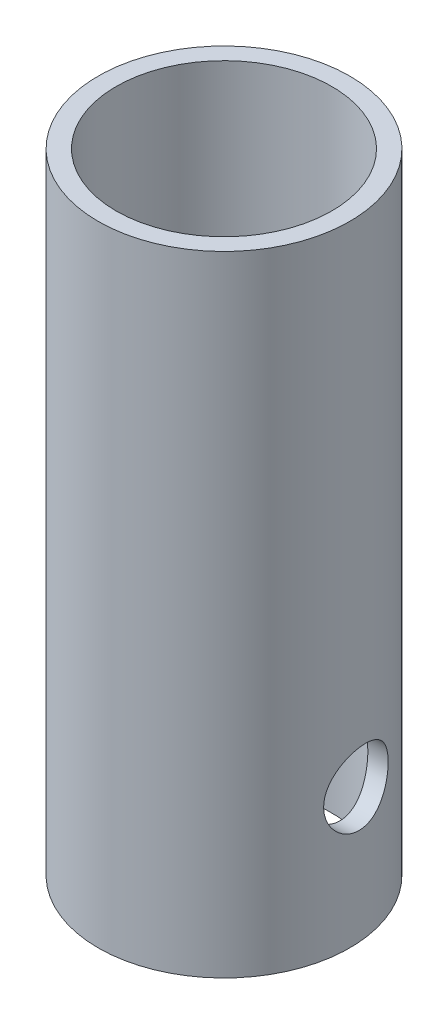
ISO-10303-21;
HEADER;
FILE_DESCRIPTION(('STEP AP214'),'2;1');
FILE_NAME('part.step','',(''),(''),'','','');
FILE_SCHEMA(('AUTOMOTIVE_DESIGN { 1 0 10303 214 1 1 1 1 }'));
ENDSEC;
DATA;
#1=APPLICATION_CONTEXT('core data for automotive mechanical design processes');
#2=APPLICATION_PROTOCOL_DEFINITION('international standard','automotive_design',2000,#1);
#3=PRODUCT_CONTEXT('',#1,'mechanical');
#4=PRODUCT('Part','Part','',(#3));
#5=PRODUCT_RELATED_PRODUCT_CATEGORY('part','',(#4));
#6=PRODUCT_DEFINITION_FORMATION('','',#4);
#7=PRODUCT_DEFINITION_CONTEXT('part definition',#1,'design');
#8=PRODUCT_DEFINITION('design','',#6,#7);
#9=PRODUCT_DEFINITION_SHAPE('','',#8);
#10=(LENGTH_UNIT() NAMED_UNIT(*) SI_UNIT(.MILLI.,.METRE.));
#11=(NAMED_UNIT(*) PLANE_ANGLE_UNIT() SI_UNIT($,.RADIAN.));
#12=(NAMED_UNIT(*) SI_UNIT($,.STERADIAN.) SOLID_ANGLE_UNIT());
#13=UNCERTAINTY_MEASURE_WITH_UNIT(LENGTH_MEASURE(1.E-05),#10,'distance_accuracy_value','');
#14=(GEOMETRIC_REPRESENTATION_CONTEXT(3) GLOBAL_UNCERTAINTY_ASSIGNED_CONTEXT((#13)) GLOBAL_UNIT_ASSIGNED_CONTEXT((#10,
#11,#12)) REPRESENTATION_CONTEXT('',''));
#15=CARTESIAN_POINT('',(0.,0.,0.));
#16=DIRECTION('',(0.,0.,1.));
#17=DIRECTION('',(1.,0.,0.));
#18=AXIS2_PLACEMENT_3D('',#15,#16,#17);
#19=CARTESIAN_POINT('',(0.,70.,0.));
#20=DIRECTION('',(0.,1.,0.));
#21=DIRECTION('',(0.,0.,1.));
#22=AXIS2_PLACEMENT_3D('',#19,#20,#21);
#23=PLANE('',#22);
#24=CARTESIAN_POINT('',(0.,70.,0.));
#25=DIRECTION('',(0.,1.,0.));
#26=DIRECTION('',(0.,0.,1.));
#27=AXIS2_PLACEMENT_3D('',#24,#25,#26);
#28=CIRCLE('',#27,14.);
#29=CARTESIAN_POINT('',(0.,70.,14.));
#30=VERTEX_POINT('',#29);
#31=EDGE_CURVE('E10',#30,#30,#28,.T.);
#32=ORIENTED_EDGE('',*,*,#31,.T.);
#33=EDGE_LOOP('',(#32));
#34=FACE_BOUND('',#33,.T.);
#35=CARTESIAN_POINT('',(0.,70.,0.));
#36=DIRECTION('',(0.,1.,0.));
#37=DIRECTION('',(0.,0.,1.));
#38=AXIS2_PLACEMENT_3D('',#35,#36,#37);
#39=CIRCLE('',#38,12.);
#40=CARTESIAN_POINT('',(0.,70.,12.));
#41=VERTEX_POINT('',#40);
#42=EDGE_CURVE('E46',#41,#41,#39,.T.);
#43=ORIENTED_EDGE('',*,*,#42,.F.);
#44=EDGE_LOOP('',(#43));
#45=FACE_BOUND('',#44,.T.);
#46=ADVANCED_FACE('F28',(#34,#45),#23,.T.);
#47=CARTESIAN_POINT('',(0.,0.,0.));
#48=DIRECTION('',(0.,1.,0.));
#49=DIRECTION('',(0.,0.,1.));
#50=AXIS2_PLACEMENT_3D('',#47,#48,#49);
#51=PLANE('',#50);
#52=CARTESIAN_POINT('',(0.,0.,0.));
#53=DIRECTION('',(0.,1.,0.));
#54=DIRECTION('',(0.,0.,1.));
#55=AXIS2_PLACEMENT_3D('',#52,#53,#54);
#56=CIRCLE('',#55,14.);
#57=CARTESIAN_POINT('',(0.,0.,14.));
#58=VERTEX_POINT('',#57);
#59=EDGE_CURVE('E41',#58,#58,#56,.T.);
#60=ORIENTED_EDGE('',*,*,#59,.F.);
#61=EDGE_LOOP('',(#60));
#62=FACE_BOUND('',#61,.T.);
#63=CARTESIAN_POINT('',(0.,0.,0.));
#64=DIRECTION('',(0.,1.,0.));
#65=DIRECTION('',(0.,0.,1.));
#66=AXIS2_PLACEMENT_3D('',#63,#64,#65);
#67=CIRCLE('',#66,12.);
#68=CARTESIAN_POINT('',(0.,0.,12.));
#69=VERTEX_POINT('',#68);
#70=EDGE_CURVE('E49',#69,#69,#67,.T.);
#71=ORIENTED_EDGE('',*,*,#70,.T.);
#72=EDGE_LOOP('',(#71));
#73=FACE_BOUND('',#72,.T.);
#74=ADVANCED_FACE('F82',(#62,#73),#51,.F.);
#75=CARTESIAN_POINT('',(0.,70.,0.));
#76=DIRECTION('',(0.,-1.,0.));
#77=DIRECTION('',(0.,0.,-1.));
#78=AXIS2_PLACEMENT_3D('',#75,#76,#77);
#79=CYLINDRICAL_SURFACE('',#78,14.);
#80=CARTESIAN_POINT('',(13.7448537585589,14.7483494793339,2.6606381106476));
#81=CARTESIAN_POINT('',(13.7448564506175,14.9694092509646,2.66063394782704));
#82=CARTESIAN_POINT('',(13.7485034274052,15.1905099028067,2.64198988242555));
#83=CARTESIAN_POINT('',(13.7624995510563,15.6263246061369,2.56806914659675));
#84=CARTESIAN_POINT('',(13.7728513282029,15.8410361165841,2.51277809941456));
#85=CARTESIAN_POINT('',(13.798554773194,16.2577467284841,2.36754624505984));
#86=CARTESIAN_POINT('',(13.8139001276107,16.4597614997485,2.27764916450707));
#87=CARTESIAN_POINT('',(13.8471343210055,16.8460961632327,2.06598678183293));
#88=CARTESIAN_POINT('',(13.8650233984399,17.0304143938092,1.94421849110837));
#89=CARTESIAN_POINT('',(13.9008092831688,17.3802659753855,1.66944188491831));
#90=CARTESIAN_POINT('',(13.9186988196706,17.5453400006386,1.51584753911972));
#91=CARTESIAN_POINT('',(13.9509108190948,17.8479118965522,1.18320017916178));
#92=CARTESIAN_POINT('',(13.9652330542912,17.9854080066114,1.00414554083832));
#93=CARTESIAN_POINT('',(13.9874194557957,18.230193584766,0.623496960005997));
#94=CARTESIAN_POINT('',(13.995217576511,18.3371670771389,0.421695438062679));
#95=CARTESIAN_POINT('',(14.0015637026131,18.5156773539868,0.00284908854898856));
#96=CARTESIAN_POINT('',(14.0001136431848,18.5872215486783,-0.21419254062365));
#97=CARTESIAN_POINT('',(13.9865186584238,18.6910678818441,-0.650936841339644));
#98=CARTESIAN_POINT('',(13.974664326776,18.7243799454902,-0.870408405433274));
#99=CARTESIAN_POINT('',(13.9402335436664,18.7541810565507,-1.31098493170535));
#100=CARTESIAN_POINT('',(13.9176586159311,18.7506753354106,-1.53208965736619));
#101=CARTESIAN_POINT('',(13.8631448943224,18.7076430364111,-1.96461985142087));
#102=CARTESIAN_POINT('',(13.8314199989336,18.6689000147265,-2.17615124426453));
#103=CARTESIAN_POINT('',(13.7601512294171,18.5579383181939,-2.58884583462994));
#104=CARTESIAN_POINT('',(13.7206065566765,18.4857162232042,-2.79000797051972));
#105=CARTESIAN_POINT('',(13.6353771039621,18.3083679996234,-3.18076870681202));
#106=CARTESIAN_POINT('',(13.5895874950081,18.202626829434,-3.37006476145821));
#107=CARTESIAN_POINT('',(13.4957119562108,17.9617178623277,-3.72828389639712));
#108=CARTESIAN_POINT('',(13.4476254468503,17.8265426081305,-3.8972017968922));
#109=CARTESIAN_POINT('',(13.3509241807669,17.5244430854321,-4.21684649054392));
#110=CARTESIAN_POINT('',(13.3023598360471,17.3565003969269,-4.36662773228151));
#111=CARTESIAN_POINT('',(13.2107980929944,16.9967351887157,-4.63628605378382));
#112=CARTESIAN_POINT('',(13.1678010193789,16.804911277389,-4.75616138963003));
#113=CARTESIAN_POINT('',(13.0913204182738,16.4018292307676,-4.96281703612543));
#114=CARTESIAN_POINT('',(13.0578585639786,16.1905282438449,-5.04952210270269));
#115=CARTESIAN_POINT('',(13.0040661993594,15.7548614442644,-5.18649653614123));
#116=CARTESIAN_POINT('',(12.9837305911725,15.5305007405828,-5.23678004903203));
#117=CARTESIAN_POINT('',(12.9590200456824,15.0858878107078,-5.29762507921733));
#118=CARTESIAN_POINT('',(12.9539703199116,14.8659024649426,-5.3098666276821));
#119=CARTESIAN_POINT('',(12.9584466577723,14.4269845937808,-5.29893379335527));
#120=CARTESIAN_POINT('',(12.9679705946914,14.2080519194462,-5.27576457800333));
#121=CARTESIAN_POINT('',(13.0001259710113,13.7836823065271,-5.19600533318789));
#122=CARTESIAN_POINT('',(13.0223901425582,13.5780398449382,-5.1403509027861));
#123=CARTESIAN_POINT('',(13.0776133008923,13.1792543895623,-4.99818056357995));
#124=CARTESIAN_POINT('',(13.1105740239266,12.9861134311082,-4.91165964434964));
#125=CARTESIAN_POINT('',(13.1854297814341,12.6112663066058,-4.70708206236737));
#126=CARTESIAN_POINT('',(13.2275681170841,12.4300935018128,-4.58813848254826));
#127=CARTESIAN_POINT('',(13.3165474586214,12.0901359855531,-4.32308636533614));
#128=CARTESIAN_POINT('',(13.3633897126667,11.9313572432397,-4.17697060915281));
#129=CARTESIAN_POINT('',(13.4601920500859,11.6334460559952,-3.85393903980336));
#130=CARTESIAN_POINT('',(13.5101984136406,11.4954926666334,-3.67594706014561));
#131=CARTESIAN_POINT('',(13.6073039128698,11.2518423083061,-3.29836778617992));
#132=CARTESIAN_POINT('',(13.6544030460566,11.1461453669417,-3.09878047339343));
#133=CARTESIAN_POINT('',(13.7420426577838,10.9704759381701,-2.68349962254371));
#134=CARTESIAN_POINT('',(13.7825945040392,10.900441066942,-2.46783497179774));
#135=CARTESIAN_POINT('',(13.8544012385688,10.7984140372224,-2.02621291063022));
#136=CARTESIAN_POINT('',(13.8856587592364,10.7664110993936,-1.80025843550034));
#137=CARTESIAN_POINT('',(13.9361388498817,10.7422880495595,-1.35373155926933));
#138=CARTESIAN_POINT('',(13.9557774399389,10.7486837474701,-1.13328563151794));
#139=CARTESIAN_POINT('',(13.984416425848,10.7978548029782,-0.695803416401848));
#140=CARTESIAN_POINT('',(13.9934178475809,10.8406266516639,-0.478766802224901));
#141=CARTESIAN_POINT('',(14.0014325854326,10.9601267521766,-0.058225886196505));
#142=CARTESIAN_POINT('',(14.0006184063962,11.0362459464261,0.145449051386907));
#143=CARTESIAN_POINT('',(13.9910431006821,11.2199884280704,0.53784158485789));
#144=CARTESIAN_POINT('',(13.9822810331714,11.3276154441894,0.726557407080805));
#145=CARTESIAN_POINT('',(13.958839409078,11.5742174668626,1.08832758276492));
#146=CARTESIAN_POINT('',(13.9440271005989,11.7138626890823,1.26091620800364));
#147=CARTESIAN_POINT('',(13.9113891279164,12.0193010161735,1.58087667068217));
#148=CARTESIAN_POINT('',(13.893562689054,12.1851008422797,1.72824200586474));
#149=CARTESIAN_POINT('',(13.8574714997445,12.5433726429944,1.99736085048718));
#150=CARTESIAN_POINT('',(13.839207768771,12.7364390555934,2.11832455035378));
#151=CARTESIAN_POINT('',(13.8058612991169,13.140473755618,2.32579022808202));
#152=CARTESIAN_POINT('',(13.7907770368319,13.3514334003088,2.4123087298637));
#153=CARTESIAN_POINT('',(13.7678336193324,13.7588113567338,2.53976676765856));
#154=CARTESIAN_POINT('',(13.7593176841302,13.9538655469309,2.58497803011359));
#155=CARTESIAN_POINT('',(13.7478268790743,14.3487189085463,2.64541373175758));
#156=CARTESIAN_POINT('',(13.7448513250115,14.5485174909693,2.66064187372355));
#157=CARTESIAN_POINT('',(13.7448537585589,14.7483494793339,2.6606381106476));
#158=B_SPLINE_CURVE_WITH_KNOTS('',3,(#80,#81,#82,#83,#84,#85,#86,#87,#88,#89,#90,#91,#92,#93,
#94,#95,#96,#97,#98,#99,#100,#101,#102,#103,#104,#105,#106,#107,#108,#109,#110,#111,#112,#113,
#114,#115,#116,#117,#118,#119,#120,#121,#122,#123,#124,#125,#126,#127,#128,#129,#130,#131,#132,
#133,#134,#135,#136,#137,#138,#139,#140,#141,#142,#143,#144,#145,#146,#147,#148,#149,#150,#151,
#152,#153,#154,#155,#156,#157),.UNSPECIFIED.,.T.,.F.,(4,2,2,2,2,2,2,2,2,2,2,2,2,2,2,2,2,2,2,2,2,
2,2,2,2,2,2,2,2,2,2,2,2,2,2,2,2,2,4),(0.,0.66244839427737,1.32515682360391,1.98703061858928,
2.64896650055686,3.32439098345709,3.9998585724122,4.68208411018638,5.364166896716,
6.02778436739061,6.69130754581593,7.34042763460938,7.98961405056968,8.65147849109391,
9.31351081397665,10.0009212587146,10.6883717794072,11.3773726077319,12.0661056863575,
12.7239560088266,13.3817103413503,14.0213952942845,14.6611841318408,15.3206221684303,
15.9802356478404,16.6690136915507,17.3577923246343,18.0453618988502,18.7327365496759,
19.3937182211341,20.0546361402925,20.7039559030894,21.3533525392955,22.0178366539992,
22.6824918074717,23.3649114860999,24.0470034013415,24.6459126013499,25.2447478341959),.UNSPECIFIED.);
#159=CARTESIAN_POINT('',(13.7448537585589,14.7483494793339,2.6606381106476));
#160=VERTEX_POINT('',#159);
#161=EDGE_CURVE('E72',#160,#160,#158,.T.);
#162=ORIENTED_EDGE('',*,*,#161,.T.);
#163=EDGE_LOOP('',(#162));
#164=FACE_BOUND('',#163,.T.);
#165=CARTESIAN_POINT('',(-13.3071938516047,14.7483494793339,4.34955075793063));
#166=CARTESIAN_POINT('',(-13.3071970405268,14.5272897077031,4.34954696227129));
#167=CARTESIAN_POINT('',(-13.3131346305545,14.306189055861,4.33150128026564));
#168=CARTESIAN_POINT('',(-13.3362162687688,13.8703743525309,4.25989538218406));
#169=CARTESIAN_POINT('',(-13.3533647149824,13.6556628420836,4.20632122814449));
#170=CARTESIAN_POINT('',(-13.3969323802249,13.2389522301837,4.06541410572322));
#171=CARTESIAN_POINT('',(-13.4233398961717,13.0369374589193,3.97812373915504));
#172=CARTESIAN_POINT('',(-13.4826424039504,12.650602795435,3.77223860510926));
#173=CARTESIAN_POINT('',(-13.5155380041068,12.4662845648585,3.65364090189464));
#174=CARTESIAN_POINT('',(-13.585222481752,12.1164329832822,3.38544901829173));
#175=CARTESIAN_POINT('',(-13.6220770348578,11.9513589580292,3.23527245389863));
#176=CARTESIAN_POINT('',(-13.6954132940005,11.6487870621155,2.90921467974067));
#177=CARTESIAN_POINT('',(-13.731894976092,11.5112909520563,2.73333183009935));
#178=CARTESIAN_POINT('',(-13.8012538391415,11.2665053739018,2.35839860055327));
#179=CARTESIAN_POINT('',(-13.8340913059185,11.1595318815289,2.15913403842292));
#180=CARTESIAN_POINT('',(-13.8924839027497,10.981021604681,1.74432945497096));
#181=CARTESIAN_POINT('',(-13.9180405551477,10.9094774099895,1.52879284790741));
#182=CARTESIAN_POINT('',(-13.9588730203552,10.8056310768237,1.09374903677612));
#183=CARTESIAN_POINT('',(-13.974408425375,10.7723190131775,0.874507289347882));
#184=CARTESIAN_POINT('',(-13.9950435360342,10.7425179021171,0.433069472055799));
#185=CARTESIAN_POINT('',(-14.0001447241502,10.7460236232572,0.210873826392768));
#186=CARTESIAN_POINT('',(-13.9998520491442,10.7890559222566,-0.225078039016645));
#187=CARTESIAN_POINT('',(-13.994683598327,10.8277989439412,-0.438912756174446));
#188=CARTESIAN_POINT('',(-13.9752988469153,10.9387606404738,-0.857267024514064));
#189=CARTESIAN_POINT('',(-13.9610816218644,11.0109827354635,-1.06178562163853));
#190=CARTESIAN_POINT('',(-13.9251164812743,11.1883309590444,-1.46011277524472));
#191=CARTESIAN_POINT('',(-13.9032269203946,11.2940721292337,-1.65363417384776));
#192=CARTESIAN_POINT('',(-13.8546353361324,11.53498109634,-2.02074781205772));
#193=CARTESIAN_POINT('',(-13.8279320934739,11.6701563505373,-2.19433498416922));
#194=CARTESIAN_POINT('',(-13.7717388684234,11.9722558732357,-2.52352518223144));
#195=CARTESIAN_POINT('',(-13.7421812996984,12.1401985617409,-2.67818372899038));
#196=CARTESIAN_POINT('',(-13.684870425958,12.4999637699521,-2.95713646136166));
#197=CARTESIAN_POINT('',(-13.6571172262314,12.6917876812788,-3.08142887620936));
#198=CARTESIAN_POINT('',(-13.6069341671199,13.0948697279001,-3.2959923846446));
#199=CARTESIAN_POINT('',(-13.5845164538388,13.3061707148228,-3.38618612275476));
#200=CARTESIAN_POINT('',(-13.5481785621801,13.7418375144033,-3.52878756572412));
#201=CARTESIAN_POINT('',(-13.5342550849969,13.966198218085,-3.58120994083341));
#202=CARTESIAN_POINT('',(-13.5173042753939,14.41081114796,-3.6446559715246));
#203=CARTESIAN_POINT('',(-13.5138163552342,14.6307964937252,-3.65743054205107));
#204=CARTESIAN_POINT('',(-13.5168981167182,15.0697143648869,-3.64602584068642));
#205=CARTESIAN_POINT('',(-13.5234663308856,15.2886470392215,-3.62185196062726));
#206=CARTESIAN_POINT('',(-13.5454516266562,15.7130166521406,-3.53871260695117));
#207=CARTESIAN_POINT('',(-13.5606206613361,15.9186591137295,-3.48072114771015));
#208=CARTESIAN_POINT('',(-13.597731973955,16.3174445691055,-3.33278618550688));
#209=CARTESIAN_POINT('',(-13.6196753514664,16.5105855275595,-3.24283749507287));
#210=CARTESIAN_POINT('',(-13.6685046521554,16.8854326520619,-3.03053801114521));
#211=CARTESIAN_POINT('',(-13.6955216732345,17.066605456855,-2.90727692611206));
#212=CARTESIAN_POINT('',(-13.750843114155,17.4065629731147,-2.63321582665883));
#213=CARTESIAN_POINT('',(-13.7791478745952,17.565341715428,-2.48240849425919));
#214=CARTESIAN_POINT('',(-13.8350201294431,17.8632529026726,-2.14984514921887));
#215=CARTESIAN_POINT('',(-13.8624996919895,18.0012062920343,-1.96701557048306));
#216=CARTESIAN_POINT('',(-13.9118881577864,18.2448566503617,-1.58029038956612));
#217=CARTESIAN_POINT('',(-13.9337970562702,18.350553591726,-1.37639476935936));
#218=CARTESIAN_POINT('',(-13.9691038495936,18.5262230204976,-0.953438132135889));
#219=CARTESIAN_POINT('',(-13.982516616855,18.5962578917258,-0.734404364213003));
#220=CARTESIAN_POINT('',(-13.9988371818351,18.6982849214454,-0.287280342053183));
#221=CARTESIAN_POINT('',(-14.0017479565954,18.7302878592742,-0.0591926728998511));
#222=CARTESIAN_POINT('',(-13.9962974274002,18.7544109091083,0.39014548759808));
#223=CARTESIAN_POINT('',(-13.9883646436775,18.7480152111976,0.61132223190909));
#224=CARTESIAN_POINT('',(-13.9623675782531,18.6988441556896,1.04896938732782));
#225=CARTESIAN_POINT('',(-13.9443042738176,18.6560723070039,1.26544025030821));
#226=CARTESIAN_POINT('',(-13.8999502567262,18.5365722064912,1.68371243351514));
#227=CARTESIAN_POINT('',(-13.8738094858484,18.4604530122417,1.88570452045179));
#228=CARTESIAN_POINT('',(-13.8155030877052,18.2767105305973,2.27385906536768));
#229=CARTESIAN_POINT('',(-13.7833367475195,18.1690835144784,2.46001964643518));
#230=CARTESIAN_POINT('',(-13.715080488828,17.9224814918051,2.81606494257612));
#231=CARTESIAN_POINT('',(-13.6789167761525,17.7828362695855,2.98547103434911));
#232=CARTESIAN_POINT('',(-13.6067358369414,17.4773979424943,3.29888744577789));
#233=CARTESIAN_POINT('',(-13.5707186505075,17.3115981163881,3.44289121731659));
#234=CARTESIAN_POINT('',(-13.5014349465772,16.9533263156734,3.7054312996781));
#235=CARTESIAN_POINT('',(-13.4682676764755,16.7602599030743,3.82318406078581));
#236=CARTESIAN_POINT('',(-13.4093757468525,16.3562252030497,4.024891113461));
#237=CARTESIAN_POINT('',(-13.3836475203269,16.145265558359,4.10886161113177));
#238=CARTESIAN_POINT('',(-13.3450291423809,15.737887601934,4.23247622470916));
#239=CARTESIAN_POINT('',(-13.3309559973508,15.5428334117368,4.27627720636605));
#240=CARTESIAN_POINT('',(-13.3120374803356,15.1479800501215,4.33481439410154));
#241=CARTESIAN_POINT('',(-13.3071909689062,14.9481814676985,4.34955418910288));
#242=CARTESIAN_POINT('',(-13.3071938516047,14.7483494793339,4.34955075793063));
#243=B_SPLINE_CURVE_WITH_KNOTS('',3,(#165,#166,#167,#168,#169,#170,#171,#172,#173,#174,#175,
#176,#177,#178,#179,#180,#181,#182,#183,#184,#185,#186,#187,#188,#189,#190,#191,#192,#193,#194,
#195,#196,#197,#198,#199,#200,#201,#202,#203,#204,#205,#206,#207,#208,#209,#210,#211,#212,#213,
#214,#215,#216,#217,#218,#219,#220,#221,#222,#223,#224,#225,#226,#227,#228,#229,#230,#231,#232,
#233,#234,#235,#236,#237,#238,#239,#240,#241,#242),.UNSPECIFIED.,.T.,.F.,(4,2,2,2,2,2,2,2,2,2,2,
2,2,2,2,2,2,2,2,2,2,2,2,2,2,2,2,2,2,2,2,2,2,2,2,2,2,2,4),(0.,0.662448394277371,1.32515682360391,
1.98703061858928,2.64896650055686,3.32439098345709,3.9998585724122,4.68208411018638,
5.364166896716,6.02778436739061,6.69130754581593,7.34042763460938,7.98961405056967,
8.6514784910939,9.31351081397664,10.0009212587146,10.6883717794072,11.3773726077319,
12.0661056863575,12.7239560088266,13.3817103413503,14.0213952942845,14.6611841318408,
15.3206221684303,15.9802356478404,16.6690136915507,17.3577923246343,18.0453618988502,
18.7327365496759,19.3937182211341,20.0546361402925,20.7039559030894,21.3533525392955,
22.0178366539992,22.6824918074717,23.3649114860999,24.0470034013415,24.6459126013499,
25.2447478341959),.UNSPECIFIED.);
#244=CARTESIAN_POINT('',(-13.3071938516047,14.7483494793339,4.34955075793063));
#245=VERTEX_POINT('',#244);
#246=EDGE_CURVE('E68',#245,#245,#243,.T.);
#247=ORIENTED_EDGE('',*,*,#246,.T.);
#248=EDGE_LOOP('',(#247));
#249=FACE_BOUND('',#248,.T.);
#250=ORIENTED_EDGE('',*,*,#31,.F.);
#251=EDGE_LOOP('',(#250));
#252=FACE_BOUND('',#251,.T.);
#253=ORIENTED_EDGE('',*,*,#59,.T.);
#254=EDGE_LOOP('',(#253));
#255=FACE_BOUND('',#254,.T.);
#256=ADVANCED_FACE('F30',(#164,#249,#252,#255),#79,.T.);
#257=CARTESIAN_POINT('',(0.,70.,0.));
#258=DIRECTION('',(0.,-1.,0.));
#259=DIRECTION('',(0.,0.,-1.));
#260=AXIS2_PLACEMENT_3D('',#257,#258,#259);
#261=CYLINDRICAL_SURFACE('',#260,12.);
#262=CARTESIAN_POINT('',(11.6711317346006,14.7483494793339,2.7901046635564));
#263=CARTESIAN_POINT('',(11.67113132204,14.96808252551,2.79010537389752));
#264=CARTESIAN_POINT('',(11.6755952029631,15.1878112573323,2.77162754511858));
#265=CARTESIAN_POINT('',(11.6927247647407,15.6208180766439,2.69843843975612));
#266=CARTESIAN_POINT('',(11.7053915510544,15.834095290643,2.64372227951461));
#267=CARTESIAN_POINT('',(11.7368904739218,16.2479202601405,2.50014918344774));
#268=CARTESIAN_POINT('',(11.7557129772691,16.448487324297,2.41134555431468));
#269=CARTESIAN_POINT('',(11.7966406706659,16.8322031170151,2.20239887297185));
#270=CARTESIAN_POINT('',(11.8187464969264,17.0153484584541,2.0822497435103));
#271=CARTESIAN_POINT('',(11.8635029529023,17.3646238225441,1.81018815216542));
#272=CARTESIAN_POINT('',(11.886151615451,17.5301381482328,1.65748448494216));
#273=CARTESIAN_POINT('',(11.9276187361749,17.8338988944581,1.32652986399691));
#274=CARTESIAN_POINT('',(11.9464368677442,17.9721429897984,1.14827673403538));
#275=CARTESIAN_POINT('',(11.9769203281212,18.2192495057353,0.768226841738623));
#276=CARTESIAN_POINT('',(11.9884813143235,18.3276712568246,0.566134163008081));
#277=CARTESIAN_POINT('',(12.0009425236387,18.5089801425161,0.146287052793201));
#278=CARTESIAN_POINT('',(12.0018458368621,18.5818775712451,-0.0714628205846783));
#279=CARTESIAN_POINT('',(11.991163062835,18.6876323111409,-0.507837585755371));
#280=CARTESIAN_POINT('',(11.9800280749764,18.7218440136411,-0.726145230250749));
#281=CARTESIAN_POINT('',(11.9453929007863,18.7537963508795,-1.16441848107118));
#282=CARTESIAN_POINT('',(11.9218950252025,18.7515437988112,-1.38438376999533));
#283=CARTESIAN_POINT('',(11.8641801212071,18.7115257324934,-1.81290695882402));
#284=CARTESIAN_POINT('',(11.8302996240778,18.674809420002,-2.02160996910907));
#285=CARTESIAN_POINT('',(11.753459232707,18.5688623972646,-2.42881902104053));
#286=CARTESIAN_POINT('',(11.7104982667271,18.4996278478164,-2.62732385558847));
#287=CARTESIAN_POINT('',(11.6170381734484,18.3288532696697,-3.01413594195575));
#288=CARTESIAN_POINT('',(11.5663788469464,18.2265563790651,-3.20206940680281));
#289=CARTESIAN_POINT('',(11.461855206189,17.9931661911099,-3.5581403851384));
#290=CARTESIAN_POINT('',(11.4079898488322,17.862063483859,-3.72627140219512));
#291=CARTESIAN_POINT('',(11.2981849896259,17.5667123985634,-4.04738284266263));
#292=CARTESIAN_POINT('',(11.2422835458114,17.4010935027944,-4.19911839047276));
#293=CARTESIAN_POINT('',(11.1360920131823,17.0454237480565,-4.4731539390855));
#294=CARTESIAN_POINT('',(11.0858027009671,16.8553695155694,-4.59544986877507));
#295=CARTESIAN_POINT('',(10.9953266349519,16.453940794505,-4.8079393491194));
#296=CARTESIAN_POINT('',(10.955216416689,16.2424206130583,-4.89789170083608));
#297=CARTESIAN_POINT('',(10.8900272172553,15.8051615119574,-5.04118926634531));
#298=CARTESIAN_POINT('',(10.8649395764879,15.5794308668657,-5.09455557233009));
#299=CARTESIAN_POINT('',(10.8338049087899,15.1347950225014,-5.16041847132314));
#300=CARTESIAN_POINT('',(10.8267003539612,14.9162997900922,-5.1751867529624));
#301=CARTESIAN_POINT('',(10.8292540076457,14.4798612837764,-5.16984300454613));
#302=CARTESIAN_POINT('',(10.8389087453902,14.261917904944,-5.14973819654013));
#303=CARTESIAN_POINT('',(10.8731354906715,13.8421512078741,-5.0770473797476));
#304=CARTESIAN_POINT('',(10.8970744124559,13.6400339392429,-5.02583829842097));
#305=CARTESIAN_POINT('',(10.9569507797671,13.2475690865881,-4.89391890281691));
#306=CARTESIAN_POINT('',(10.9928906033577,13.057223844142,-4.81320274120157));
#307=CARTESIAN_POINT('',(11.075173600783,12.6853109506311,-4.62080784232873));
#308=CARTESIAN_POINT('',(11.1218745889444,12.5043963573032,-4.50802240356541));
#309=CARTESIAN_POINT('',(11.2207740115899,12.1638069857207,-4.25588388848873));
#310=CARTESIAN_POINT('',(11.2729743868725,12.0041397512026,-4.11652141867495));
#311=CARTESIAN_POINT('',(11.3821303190675,11.7002092757868,-3.80473637589635));
#312=CARTESIAN_POINT('',(11.4391788744015,11.5575383092067,-3.63078936077184));
#313=CARTESIAN_POINT('',(11.5502355898527,11.3038179253423,-3.26027895896967));
#314=CARTESIAN_POINT('',(11.6042436125935,11.1927699359184,-3.06371455161981));
#315=CARTESIAN_POINT('',(11.7051342257412,11.005595945357,-2.65230720860898));
#316=CARTESIAN_POINT('',(11.7520012438124,10.9295455542666,-2.43742587561341));
#317=CARTESIAN_POINT('',(11.8349993533972,10.8157227324373,-1.99578998954658));
#318=CARTESIAN_POINT('',(11.8711347051111,10.7779350979581,-1.7690401901172));
#319=CARTESIAN_POINT('',(11.9289241073534,10.7433107968361,-1.32245383026674));
#320=CARTESIAN_POINT('',(11.9512222124082,10.7444856474401,-1.10285371479341));
#321=CARTESIAN_POINT('',(11.9835071751072,10.78308777846,-0.665967687465829));
#322=CARTESIAN_POINT('',(11.9934958473673,10.8205097139973,-0.448681439191913));
#323=CARTESIAN_POINT('',(12.0017547617656,10.9288741897589,-0.0287894039638095));
#324=CARTESIAN_POINT('',(12.0003371882013,10.9988746324413,0.174055146485652));
#325=CARTESIAN_POINT('',(11.9882520873852,11.1698386140368,0.565934438276221));
#326=CARTESIAN_POINT('',(11.977583295669,11.2708063843715,0.754967287992505));
#327=CARTESIAN_POINT('',(11.9491056848889,11.5040637108621,1.11948768790499));
#328=CARTESIAN_POINT('',(11.9311065634419,11.6371461962762,1.29445238491766));
#329=CARTESIAN_POINT('',(11.8912222599053,11.9295092556134,1.62044889345579));
#330=CARTESIAN_POINT('',(11.8693359910521,12.0887971550918,1.77147398957375));
#331=CARTESIAN_POINT('',(11.8243024475457,12.4362608659718,2.05102899197776));
#332=CARTESIAN_POINT('',(11.8011390283685,12.6253113109064,2.17847194252916));
#333=CARTESIAN_POINT('',(11.7581770677402,13.0225804529183,2.39958715510687));
#334=CARTESIAN_POINT('',(11.7383779823612,13.2307960430674,2.49326487886931));
#335=CARTESIAN_POINT('',(11.7059159288069,13.6542723883506,2.64142945568023));
#336=CARTESIAN_POINT('',(11.6930575013636,13.8691370339394,2.69700318157973));
#337=CARTESIAN_POINT('',(11.6756667246431,14.3054535910261,2.77133550845551));
#338=CARTESIAN_POINT('',(11.6711321503769,14.5269037261162,2.79010394767853));
#339=CARTESIAN_POINT('',(11.6711317346006,14.7483494793339,2.7901046635564));
#340=B_SPLINE_CURVE_WITH_KNOTS('',3,(#262,#263,#264,#265,#266,#267,#268,#269,#270,#271,#272,
#273,#274,#275,#276,#277,#278,#279,#280,#281,#282,#283,#284,#285,#286,#287,#288,#289,#290,#291,
#292,#293,#294,#295,#296,#297,#298,#299,#300,#301,#302,#303,#304,#305,#306,#307,#308,#309,#310,
#311,#312,#313,#314,#315,#316,#317,#318,#319,#320,#321,#322,#323,#324,#325,#326,#327,#328,#329,
#330,#331,#332,#333,#334,#335,#336,#337,#338,#339),.UNSPECIFIED.,.T.,.F.,(4,2,2,2,2,2,2,2,2,2,2,
2,2,2,2,2,2,2,2,2,2,2,2,2,2,2,2,2,2,2,2,2,2,2,2,2,2,2,4),(0.,0.658387062029329,1.31686286963712,
1.97431310686442,2.63189090510288,3.30777665594002,3.98372001129044,4.66917189593898,
5.3544250341996,6.01486280710743,6.67517718140328,7.31601952298509,7.95693754339347,
8.61371188836587,9.27070109945039,9.96190241619718,10.6531992621812,11.3495493969262,
12.0454977410506,12.6994543334954,13.3532755108369,13.9800716349923,14.6069920370245,
15.2589213393994,15.9110814909682,16.6041089902967,17.2971677766776,17.9917169224146,
18.6859899800049,19.3448875056542,20.0036878871788,20.6445197863308,21.2854392887464,
21.9441817271841,22.6031086267263,23.287346916816,23.9714744773697,24.6351707645057,
25.2986896179375),.UNSPECIFIED.);
#341=CARTESIAN_POINT('',(11.6711317346006,14.7483494793339,2.7901046635564));
#342=VERTEX_POINT('',#341);
#343=EDGE_CURVE('E33',#342,#342,#340,.T.);
#344=ORIENTED_EDGE('',*,*,#343,.F.);
#345=EDGE_LOOP('',(#344));
#346=FACE_BOUND('',#345,.T.);
#347=CARTESIAN_POINT('',(-11.2334718276464,14.7483494793339,4.22008420502184));
#348=CARTESIAN_POINT('',(-11.2334713299378,14.5286164331577,4.22008485853306));
#349=CARTESIAN_POINT('',(-11.2401988042796,14.3088877013355,4.20230572811956));
#350=CARTESIAN_POINT('',(-11.2662985491668,13.8758808820239,4.13181551356979));
#351=CARTESIAN_POINT('',(-11.2856725240124,13.6626036680248,4.07909972119434));
#352=CARTESIAN_POINT('',(-11.3347843489497,13.2487786985273,3.94055931298298));
#353=CARTESIAN_POINT('',(-11.3645060103981,13.0482116343707,3.8547863917304));
#354=CARTESIAN_POINT('',(-11.4311044997398,12.6644958416527,3.65255278189174));
#355=CARTESIAN_POINT('',(-11.4679827147869,12.4813505002137,3.53608614237653));
#356=CARTESIAN_POINT('',(-11.5462304138662,12.1320751361237,3.27170394285199));
#357=CARTESIAN_POINT('',(-11.587696355449,11.966560810435,3.12300307672362));
#358=CARTESIAN_POINT('',(-11.6700053262722,11.6628000642097,2.79977604111527));
#359=CARTESIAN_POINT('',(-11.7108483021217,11.5245559688693,2.62524767167178));
#360=CARTESIAN_POINT('',(-11.7883653310649,11.2774494529325,2.25194046277385));
#361=CARTESIAN_POINT('',(-11.8249726576256,11.1690277018432,2.05285502674065));
#362=CARTESIAN_POINT('',(-11.8895573263698,10.9877188161517,1.63781804253734));
#363=CARTESIAN_POINT('',(-11.9175371677348,10.9148213874227,1.42187140142419));
#364=CARTESIAN_POINT('',(-11.9612132671613,10.8090666475269,0.987556474582409));
#365=CARTESIAN_POINT('',(-11.9773176627748,10.7748549450267,0.769559080007029));
#366=CARTESIAN_POINT('',(-11.9974634900722,10.7429026077883,0.33038123070405));
#367=CARTESIAN_POINT('',(-12.0015071750821,10.7451551598565,0.109201378321477));
#368=CARTESIAN_POINT('',(-11.9975397877479,10.7851732261744,-0.323172757520225));
#369=CARTESIAN_POINT('',(-11.9898806821464,10.8218895386658,-0.534469167071232));
#370=CARTESIAN_POINT('',(-11.9642852872656,10.9278365614031,-0.948073487021884));
#371=CARTESIAN_POINT('',(-11.9463477844324,10.9970711108513,-1.15038033299834));
#372=CARTESIAN_POINT('',(-11.9017247864436,11.167845688998,-1.54581321889172));
#373=CARTESIAN_POINT('',(-11.8748338447661,11.2701425796027,-1.7385882998196));
#374=CARTESIAN_POINT('',(-11.8154096576811,11.5035327675579,-2.10489486416065));
#375=CARTESIAN_POINT('',(-11.7828745692516,11.6346354748088,-2.27842003132838));
#376=CARTESIAN_POINT('',(-11.7138619362698,11.9299865601044,-2.61069540025203));
#377=CARTESIAN_POINT('',(-11.6772673176628,12.0956054558734,-2.76820565953312));
#378=CARTESIAN_POINT('',(-11.6059846938558,12.4512752106113,-3.05332126950351));
#379=CARTESIAN_POINT('',(-11.5712969528632,12.6413294430984,-3.18092248410015));
#380=CARTESIAN_POINT('',(-11.5079527141686,13.0427581641628,-3.40301526922115));
#381=CARTESIAN_POINT('',(-11.4793421575703,13.2542783456095,-3.49725799434937));
#382=CARTESIAN_POINT('',(-11.4324823959443,13.6915374467104,-3.64755099732698));
#383=CARTESIAN_POINT('',(-11.4142272219926,13.9172680918021,-3.70362328065597));
#384=CARTESIAN_POINT('',(-11.3915262932209,14.3619039361664,-3.77284724203743));
#385=CARTESIAN_POINT('',(-11.3863137731401,14.5803991685755,-3.78838450293815));
#386=CARTESIAN_POINT('',(-11.3881829462566,15.0168376748914,-3.78276462872805));
#387=CARTESIAN_POINT('',(-11.3952620939089,15.2347810537238,-3.7616150912771));
#388=CARTESIAN_POINT('',(-11.4201818389921,15.6545477507937,-3.68523164252344));
#389=CARTESIAN_POINT('',(-11.4375655277874,15.8566650194248,-3.63144270917849));
#390=CARTESIAN_POINT('',(-11.4805689196996,16.2491298720797,-3.49310032744761));
#391=CARTESIAN_POINT('',(-11.5061902551273,16.4394751145257,-3.4085407813482));
#392=CARTESIAN_POINT('',(-11.563904393152,16.8113880080367,-3.2074055853987));
#393=CARTESIAN_POINT('',(-11.5962145809789,16.9923026013646,-3.08968732320085));
#394=CARTESIAN_POINT('',(-11.6629852540096,17.3328919729471,-2.82720569754355));
#395=CARTESIAN_POINT('',(-11.6974464965858,17.4925592074651,-2.68243277213155));
#396=CARTESIAN_POINT('',(-11.7669752509764,17.7964896828809,-2.35949209221231));
#397=CARTESIAN_POINT('',(-11.801945430249,17.939160649461,-2.17980016613305));
#398=CARTESIAN_POINT('',(-11.866055998055,18.1928810333255,-1.79835372561224));
#399=CARTESIAN_POINT('',(-11.8951961233286,18.3039290227493,-1.59659821551099));
#400=CARTESIAN_POINT('',(-11.9441328045167,18.4911030133108,-1.17583685923069));
#401=CARTESIAN_POINT('',(-11.9639091331908,18.5671534044012,-0.956794850755115));
#402=CARTESIAN_POINT('',(-11.9913324500397,18.6809762262305,-0.508265137414205));
#403=CARTESIAN_POINT('',(-11.9989842565872,18.7187638607097,-0.278781619397527));
#404=CARTESIAN_POINT('',(-12.0007788819452,18.7533881618316,0.171524688725996));
#405=CARTESIAN_POINT('',(-11.9955901628672,18.7522133112277,0.392192976885547));
#406=CARTESIAN_POINT('',(-11.9732849156921,18.7136111802077,0.8297020575216));
#407=CARTESIAN_POINT('',(-11.9561701462765,18.6761892446704,1.04654340950578));
#408=CARTESIAN_POINT('',(-11.9121391168811,18.5678247689089,1.46420212109386));
#409=CARTESIAN_POINT('',(-11.8855029198155,18.4978243262264,1.66529521935369));
#410=CARTESIAN_POINT('',(-11.8247700522793,18.326860344631,2.05262834186821));
#411=CARTESIAN_POINT('',(-11.7906723624418,18.2258925742963,2.23886633191398));
#412=CARTESIAN_POINT('',(-11.7170771521519,17.9926352478057,2.59701412443891));
#413=CARTESIAN_POINT('',(-11.6774558390898,17.8595527623915,2.76838146416511));
#414=CARTESIAN_POINT('',(-11.5973340802772,17.5671897030544,3.08688575771926));
#415=CARTESIAN_POINT('',(-11.5568333914587,17.4079018035759,3.2340159131157));
#416=CARTESIAN_POINT('',(-11.4773787324551,17.060438092696,3.50579887169195));
#417=CARTESIAN_POINT('',(-11.4385439377344,16.8713876477614,3.62937115156179));
#418=CARTESIAN_POINT('',(-11.368413466241,16.4741185057494,3.84342578071621));
#419=CARTESIAN_POINT('',(-11.3371165704382,16.2659029156004,3.93391348167198));
#420=CARTESIAN_POINT('',(-11.2864780093115,15.8424265703172,4.0768899233312));
#421=CARTESIAN_POINT('',(-11.2668072181932,15.6275619247283,4.13043278600636));
#422=CARTESIAN_POINT('',(-11.2403060938467,15.1912453676417,4.20202485499506));
#423=CARTESIAN_POINT('',(-11.2334723292343,14.9697952325516,4.22008354641683));
#424=CARTESIAN_POINT('',(-11.2334718276464,14.7483494793339,4.22008420502184));
#425=B_SPLINE_CURVE_WITH_KNOTS('',3,(#347,#348,#349,#350,#351,#352,#353,#354,#355,#356,#357,
#358,#359,#360,#361,#362,#363,#364,#365,#366,#367,#368,#369,#370,#371,#372,#373,#374,#375,#376,
#377,#378,#379,#380,#381,#382,#383,#384,#385,#386,#387,#388,#389,#390,#391,#392,#393,#394,#395,
#396,#397,#398,#399,#400,#401,#402,#403,#404,#405,#406,#407,#408,#409,#410,#411,#412,#413,#414,
#415,#416,#417,#418,#419,#420,#421,#422,#423,#424),.UNSPECIFIED.,.T.,.F.,(4,2,2,2,2,2,2,2,2,2,2,
2,2,2,2,2,2,2,2,2,2,2,2,2,2,2,2,2,2,2,2,2,2,2,2,2,2,2,4),(0.,0.658387062029333,1.31686286963712,
1.97431310686443,2.63189090510288,3.30777665594002,3.98372001129045,4.66917189593898,
5.35442503419961,6.01486280710744,6.67517718140328,7.31601952298509,7.95693754339347,
8.61371188836587,9.27070109945039,9.96190241619718,10.6531992621812,11.3495493969262,
12.0454977410506,12.6994543334954,13.3532755108369,13.9800716349923,14.6069920370245,
15.2589213393995,15.9110814909682,16.6041089902967,17.2971677766776,17.9917169224146,
18.6859899800049,19.3448875056542,20.0036878871788,20.6445197863308,21.2854392887464,
21.9441817271841,22.6031086267263,23.287346916816,23.9714744773697,24.6351707645058,
25.2986896179375),.UNSPECIFIED.);
#426=CARTESIAN_POINT('',(-11.2334718276464,14.7483494793339,4.22008420502184));
#427=VERTEX_POINT('',#426);
#428=EDGE_CURVE('E51',#427,#427,#425,.T.);
#429=ORIENTED_EDGE('',*,*,#428,.F.);
#430=EDGE_LOOP('',(#429));
#431=FACE_BOUND('',#430,.T.);
#432=ORIENTED_EDGE('',*,*,#42,.T.);
#433=EDGE_LOOP('',(#432));
#434=FACE_BOUND('',#433,.T.);
#435=ORIENTED_EDGE('',*,*,#70,.F.);
#436=EDGE_LOOP('',(#435));
#437=FACE_BOUND('',#436,.T.);
#438=ADVANCED_FACE('F55',(#346,#431,#434,#437),#261,.F.);
#439=CARTESIAN_POINT('',(34.9799837601699,14.7483494793339,-2.67290082658915));
#440=DIRECTION('',(-0.99805680324043,0.,0.0623106532263508));
#441=DIRECTION('',(0.0623106532263508,0.,0.99805680324043));
#442=AXIS2_PLACEMENT_3D('',#439,#440,#441);
#443=CYLINDRICAL_SURFACE('',#442,3.99999999991);
#444=ORIENTED_EDGE('',*,*,#428,.T.);
#445=EDGE_LOOP('',(#444));
#446=FACE_BOUND('',#445,.T.);
#447=ORIENTED_EDGE('',*,*,#246,.F.);
#448=EDGE_LOOP('',(#447));
#449=FACE_BOUND('',#448,.T.);
#450=ADVANCED_FACE('F61',(#446,#449),#443,.F.);
#451=ORIENTED_EDGE('',*,*,#343,.T.);
#452=EDGE_LOOP('',(#451));
#453=FACE_BOUND('',#452,.T.);
#454=ORIENTED_EDGE('',*,*,#161,.F.);
#455=EDGE_LOOP('',(#454));
#456=FACE_BOUND('',#455,.T.);
#457=ADVANCED_FACE('F58',(#453,#456),#443,.F.);
#458=CLOSED_SHELL('',(#46,#74,#256,#438,#450,#457));
#459=MANIFOLD_SOLID_BREP('B2',#458);
#460=ADVANCED_BREP_SHAPE_REPRESENTATION('',(#18,#459),#14);
#461=SHAPE_DEFINITION_REPRESENTATION(#9,#460);
ENDSEC;
END-ISO-10303-21;
